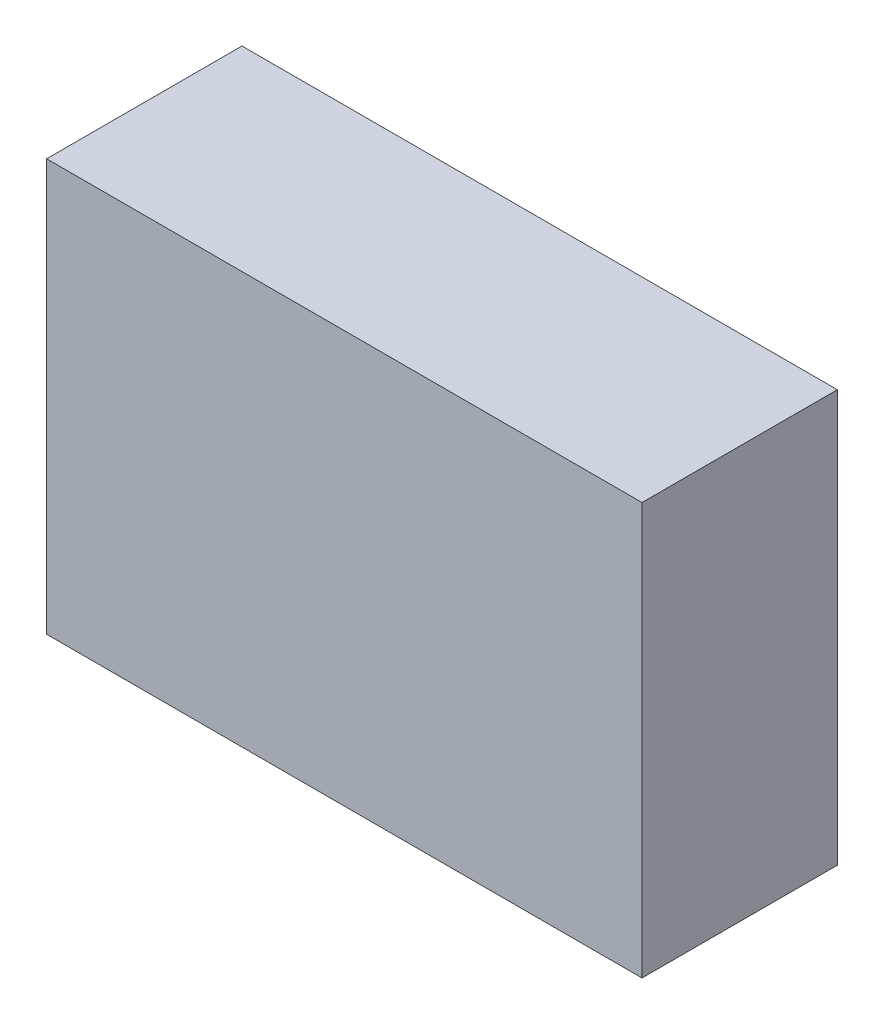
ISO-10303-21;
HEADER;
FILE_DESCRIPTION(('STEP AP214'),'2;1');
FILE_NAME('part.step','',(''),(''),'','','');
FILE_SCHEMA(('AUTOMOTIVE_DESIGN { 1 0 10303 214 1 1 1 1 }'));
ENDSEC;
DATA;
#1=APPLICATION_CONTEXT('core data for automotive mechanical design processes');
#2=APPLICATION_PROTOCOL_DEFINITION('international standard','automotive_design',2000,#1);
#3=PRODUCT_CONTEXT('',#1,'mechanical');
#4=PRODUCT('Part','Part','',(#3));
#5=PRODUCT_RELATED_PRODUCT_CATEGORY('part','',(#4));
#6=PRODUCT_DEFINITION_FORMATION('','',#4);
#7=PRODUCT_DEFINITION_CONTEXT('part definition',#1,'design');
#8=PRODUCT_DEFINITION('design','',#6,#7);
#9=PRODUCT_DEFINITION_SHAPE('','',#8);
#10=(LENGTH_UNIT() NAMED_UNIT(*) SI_UNIT(.MILLI.,.METRE.));
#11=(NAMED_UNIT(*) PLANE_ANGLE_UNIT() SI_UNIT($,.RADIAN.));
#12=(NAMED_UNIT(*) SI_UNIT($,.STERADIAN.) SOLID_ANGLE_UNIT());
#13=UNCERTAINTY_MEASURE_WITH_UNIT(LENGTH_MEASURE(1.E-05),#10,'distance_accuracy_value','');
#14=(GEOMETRIC_REPRESENTATION_CONTEXT(3) GLOBAL_UNCERTAINTY_ASSIGNED_CONTEXT((#13)) GLOBAL_UNIT_ASSIGNED_CONTEXT((#10,
#11,#12)) REPRESENTATION_CONTEXT('',''));
#15=CARTESIAN_POINT('',(0.,0.,0.));
#16=DIRECTION('',(0.,0.,1.));
#17=DIRECTION('',(1.,0.,0.));
#18=AXIS2_PLACEMENT_3D('',#15,#16,#17);
#19=CARTESIAN_POINT('',(-1.524,-1.0922,1.));
#20=DIRECTION('',(1.,0.,0.));
#21=DIRECTION('',(0.,0.,-1.));
#22=AXIS2_PLACEMENT_3D('',#19,#20,#21);
#23=PLANE('',#22);
#24=DIRECTION('',(0.,-1.,0.));
#25=VECTOR('',#24,1.);
#26=CARTESIAN_POINT('',(-1.524,-1.0922,0.));
#27=LINE('',#26,#25);
#28=CARTESIAN_POINT('',(-1.524,1.016,0.));
#29=VERTEX_POINT('',#28);
#30=CARTESIAN_POINT('',(-1.524,-1.0922,0.));
#31=VERTEX_POINT('',#30);
#32=EDGE_CURVE('E95',#29,#31,#27,.T.);
#33=ORIENTED_EDGE('',*,*,#32,.T.);
#34=DIRECTION('',(0.,0.,-1.));
#35=VECTOR('',#34,1.);
#36=CARTESIAN_POINT('',(-1.524,-1.0922,1.));
#37=LINE('',#36,#35);
#38=CARTESIAN_POINT('',(-1.524,-1.0922,1.));
#39=VERTEX_POINT('',#38);
#40=EDGE_CURVE('E11',#39,#31,#37,.T.);
#41=ORIENTED_EDGE('',*,*,#40,.F.);
#42=DIRECTION('',(0.,-1.,0.));
#43=VECTOR('',#42,1.);
#44=CARTESIAN_POINT('',(-1.524,-1.0922,1.));
#45=LINE('',#44,#43);
#46=CARTESIAN_POINT('',(-1.524,1.016,1.));
#47=VERTEX_POINT('',#46);
#48=EDGE_CURVE('E83',#47,#39,#45,.T.);
#49=ORIENTED_EDGE('',*,*,#48,.F.);
#50=DIRECTION('',(0.,0.,-1.));
#51=VECTOR('',#50,1.);
#52=CARTESIAN_POINT('',(-1.524,1.016,1.));
#53=LINE('',#52,#51);
#54=EDGE_CURVE('E91',#47,#29,#53,.T.);
#55=ORIENTED_EDGE('',*,*,#54,.T.);
#56=EDGE_LOOP('',(#33,#41,#49,#55));
#57=FACE_BOUND('',#56,.T.);
#58=ADVANCED_FACE('F32',(#57),#23,.F.);
#59=CARTESIAN_POINT('',(1.524,-1.0922,1.));
#60=DIRECTION('',(0.,1.,0.));
#61=DIRECTION('',(0.,0.,1.));
#62=AXIS2_PLACEMENT_3D('',#59,#60,#61);
#63=PLANE('',#62);
#64=DIRECTION('',(1.,0.,0.));
#65=VECTOR('',#64,1.);
#66=CARTESIAN_POINT('',(1.524,-1.0922,0.));
#67=LINE('',#66,#65);
#68=CARTESIAN_POINT('',(1.524,-1.0922,0.));
#69=VERTEX_POINT('',#68);
#70=EDGE_CURVE('E87',#31,#69,#67,.T.);
#71=ORIENTED_EDGE('',*,*,#70,.T.);
#72=DIRECTION('',(0.,0.,-1.));
#73=VECTOR('',#72,1.);
#74=CARTESIAN_POINT('',(1.524,-1.0922,1.));
#75=LINE('',#74,#73);
#76=CARTESIAN_POINT('',(1.524,-1.0922,1.));
#77=VERTEX_POINT('',#76);
#78=EDGE_CURVE('E40',#77,#69,#75,.T.);
#79=ORIENTED_EDGE('',*,*,#78,.F.);
#80=DIRECTION('',(1.,0.,0.));
#81=VECTOR('',#80,1.);
#82=CARTESIAN_POINT('',(1.524,-1.0922,1.));
#83=LINE('',#82,#81);
#84=EDGE_CURVE('E78',#39,#77,#83,.T.);
#85=ORIENTED_EDGE('',*,*,#84,.F.);
#86=ORIENTED_EDGE('',*,*,#40,.T.);
#87=EDGE_LOOP('',(#71,#79,#85,#86));
#88=FACE_BOUND('',#87,.T.);
#89=ADVANCED_FACE('F86',(#88),#63,.F.);
#90=CARTESIAN_POINT('',(1.524,1.016,1.));
#91=DIRECTION('',(-1.,0.,0.));
#92=DIRECTION('',(0.,0.,1.));
#93=AXIS2_PLACEMENT_3D('',#90,#91,#92);
#94=PLANE('',#93);
#95=DIRECTION('',(0.,1.,0.));
#96=VECTOR('',#95,1.);
#97=CARTESIAN_POINT('',(1.524,1.016,0.));
#98=LINE('',#97,#96);
#99=CARTESIAN_POINT('',(1.524,1.016,0.));
#100=VERTEX_POINT('',#99);
#101=EDGE_CURVE('E65',#69,#100,#98,.T.);
#102=ORIENTED_EDGE('',*,*,#101,.T.);
#103=DIRECTION('',(0.,0.,-1.));
#104=VECTOR('',#103,1.);
#105=CARTESIAN_POINT('',(1.524,1.016,1.));
#106=LINE('',#105,#104);
#107=CARTESIAN_POINT('',(1.524,1.016,1.));
#108=VERTEX_POINT('',#107);
#109=EDGE_CURVE('E88',#108,#100,#106,.T.);
#110=ORIENTED_EDGE('',*,*,#109,.F.);
#111=DIRECTION('',(0.,1.,0.));
#112=VECTOR('',#111,1.);
#113=CARTESIAN_POINT('',(1.524,1.016,1.));
#114=LINE('',#113,#112);
#115=EDGE_CURVE('E81',#77,#108,#114,.T.);
#116=ORIENTED_EDGE('',*,*,#115,.F.);
#117=ORIENTED_EDGE('',*,*,#78,.T.);
#118=EDGE_LOOP('',(#102,#110,#116,#117));
#119=FACE_BOUND('',#118,.T.);
#120=ADVANCED_FACE('F89',(#119),#94,.F.);
#121=CARTESIAN_POINT('',(-1.524,1.016,1.));
#122=DIRECTION('',(0.,-1.,0.));
#123=DIRECTION('',(0.,0.,-1.));
#124=AXIS2_PLACEMENT_3D('',#121,#122,#123);
#125=PLANE('',#124);
#126=DIRECTION('',(-1.,0.,0.));
#127=VECTOR('',#126,1.);
#128=CARTESIAN_POINT('',(-1.524,1.016,0.));
#129=LINE('',#128,#127);
#130=EDGE_CURVE('E71',#100,#29,#129,.T.);
#131=ORIENTED_EDGE('',*,*,#130,.T.);
#132=ORIENTED_EDGE('',*,*,#54,.F.);
#133=DIRECTION('',(-1.,0.,0.));
#134=VECTOR('',#133,1.);
#135=CARTESIAN_POINT('',(-1.524,1.016,1.));
#136=LINE('',#135,#134);
#137=EDGE_CURVE('E48',#108,#47,#136,.T.);
#138=ORIENTED_EDGE('',*,*,#137,.F.);
#139=ORIENTED_EDGE('',*,*,#109,.T.);
#140=EDGE_LOOP('',(#131,#132,#138,#139));
#141=FACE_BOUND('',#140,.T.);
#142=ADVANCED_FACE('F102',(#141),#125,.F.);
#143=CARTESIAN_POINT('',(0.,0.,1.));
#144=DIRECTION('',(0.,0.,-1.));
#145=DIRECTION('',(-1.,0.,0.));
#146=AXIS2_PLACEMENT_3D('',#143,#144,#145);
#147=PLANE('',#146);
#148=ORIENTED_EDGE('',*,*,#48,.T.);
#149=ORIENTED_EDGE('',*,*,#84,.T.);
#150=ORIENTED_EDGE('',*,*,#115,.T.);
#151=ORIENTED_EDGE('',*,*,#137,.T.);
#152=EDGE_LOOP('',(#148,#149,#150,#151));
#153=FACE_BOUND('',#152,.T.);
#154=ADVANCED_FACE('F79',(#153),#147,.F.);
#155=CARTESIAN_POINT('',(0.,0.,0.));
#156=DIRECTION('',(0.,0.,-1.));
#157=DIRECTION('',(-1.,0.,0.));
#158=AXIS2_PLACEMENT_3D('',#155,#156,#157);
#159=PLANE('',#158);
#160=ORIENTED_EDGE('',*,*,#32,.F.);
#161=ORIENTED_EDGE('',*,*,#130,.F.);
#162=ORIENTED_EDGE('',*,*,#101,.F.);
#163=ORIENTED_EDGE('',*,*,#70,.F.);
#164=EDGE_LOOP('',(#160,#161,#162,#163));
#165=FACE_BOUND('',#164,.T.);
#166=ADVANCED_FACE('F105',(#165),#159,.T.);
#167=CLOSED_SHELL('',(#58,#89,#120,#142,#154,#166));
#168=MANIFOLD_SOLID_BREP('B2',#167);
#169=ADVANCED_BREP_SHAPE_REPRESENTATION('',(#18,#168),#14);
#170=SHAPE_DEFINITION_REPRESENTATION(#9,#169);
ENDSEC;
END-ISO-10303-21;
